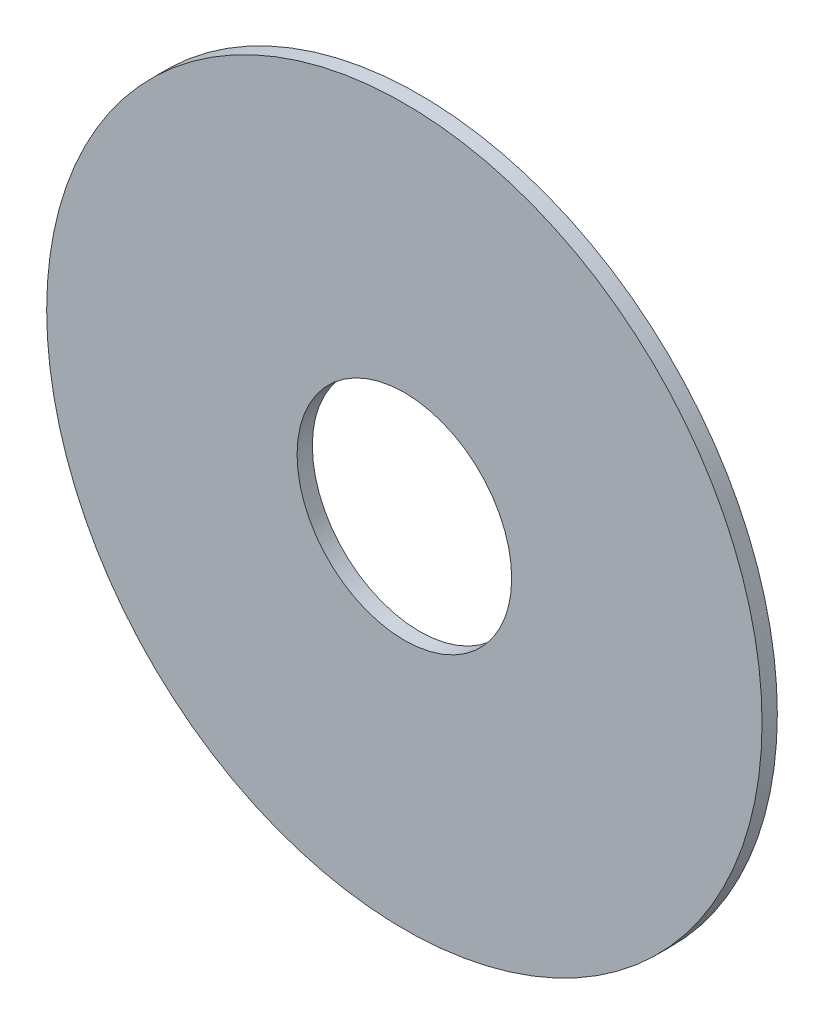
ISO-10303-21;
HEADER;
FILE_DESCRIPTION(('STEP AP214'),'2;1');
FILE_NAME('part.step','',(''),(''),'','','');
FILE_SCHEMA(('AUTOMOTIVE_DESIGN { 1 0 10303 214 1 1 1 1 }'));
ENDSEC;
DATA;
#1=APPLICATION_CONTEXT('core data for automotive mechanical design processes');
#2=APPLICATION_PROTOCOL_DEFINITION('international standard','automotive_design',2000,#1);
#3=PRODUCT_CONTEXT('',#1,'mechanical');
#4=PRODUCT('Part','Part','',(#3));
#5=PRODUCT_RELATED_PRODUCT_CATEGORY('part','',(#4));
#6=PRODUCT_DEFINITION_FORMATION('','',#4);
#7=PRODUCT_DEFINITION_CONTEXT('part definition',#1,'design');
#8=PRODUCT_DEFINITION('design','',#6,#7);
#9=PRODUCT_DEFINITION_SHAPE('','',#8);
#10=(LENGTH_UNIT() NAMED_UNIT(*) SI_UNIT(.MILLI.,.METRE.));
#11=(NAMED_UNIT(*) PLANE_ANGLE_UNIT() SI_UNIT($,.RADIAN.));
#12=(NAMED_UNIT(*) SI_UNIT($,.STERADIAN.) SOLID_ANGLE_UNIT());
#13=UNCERTAINTY_MEASURE_WITH_UNIT(LENGTH_MEASURE(1.E-05),#10,'distance_accuracy_value','');
#14=(GEOMETRIC_REPRESENTATION_CONTEXT(3) GLOBAL_UNCERTAINTY_ASSIGNED_CONTEXT((#13)) GLOBAL_UNIT_ASSIGNED_CONTEXT((#10,
#11,#12)) REPRESENTATION_CONTEXT('',''));
#15=CARTESIAN_POINT('',(0.,0.,0.));
#16=DIRECTION('',(0.,0.,1.));
#17=DIRECTION('',(1.,0.,0.));
#18=AXIS2_PLACEMENT_3D('',#15,#16,#17);
#19=CARTESIAN_POINT('',(0.,0.,0.8128));
#20=DIRECTION('',(0.,0.,1.));
#21=DIRECTION('',(1.,0.,0.));
#22=AXIS2_PLACEMENT_3D('',#19,#20,#21);
#23=PLANE('',#22);
#24=CARTESIAN_POINT('',(0.,0.,0.8128));
#25=DIRECTION('',(0.,0.,1.));
#26=DIRECTION('',(1.,0.,0.));
#27=AXIS2_PLACEMENT_3D('',#24,#25,#26);
#28=CIRCLE('',#27,19.05);
#29=CARTESIAN_POINT('',(19.05,0.,0.8128));
#30=VERTEX_POINT('',#29);
#31=EDGE_CURVE('E10',#30,#30,#28,.T.);
#32=ORIENTED_EDGE('',*,*,#31,.T.);
#33=EDGE_LOOP('',(#32));
#34=FACE_BOUND('',#33,.T.);
#35=CARTESIAN_POINT('',(0.,0.,0.8128));
#36=DIRECTION('',(0.,0.,1.));
#37=DIRECTION('',(1.,0.,0.));
#38=AXIS2_PLACEMENT_3D('',#35,#36,#37);
#39=CIRCLE('',#38,5.715);
#40=CARTESIAN_POINT('',(5.715,0.,0.8128));
#41=VERTEX_POINT('',#40);
#42=EDGE_CURVE('E41',#41,#41,#39,.T.);
#43=ORIENTED_EDGE('',*,*,#42,.F.);
#44=EDGE_LOOP('',(#43));
#45=FACE_BOUND('',#44,.T.);
#46=ADVANCED_FACE('F30',(#34,#45),#23,.T.);
#47=CARTESIAN_POINT('',(0.,0.,0.));
#48=DIRECTION('',(0.,0.,1.));
#49=DIRECTION('',(1.,0.,0.));
#50=AXIS2_PLACEMENT_3D('',#47,#48,#49);
#51=PLANE('',#50);
#52=CARTESIAN_POINT('',(0.,0.,0.));
#53=DIRECTION('',(0.,0.,1.));
#54=DIRECTION('',(1.,0.,0.));
#55=AXIS2_PLACEMENT_3D('',#52,#53,#54);
#56=CIRCLE('',#55,19.05);
#57=CARTESIAN_POINT('',(19.05,0.,0.));
#58=VERTEX_POINT('',#57);
#59=EDGE_CURVE('E34',#58,#58,#56,.T.);
#60=ORIENTED_EDGE('',*,*,#59,.F.);
#61=EDGE_LOOP('',(#60));
#62=FACE_BOUND('',#61,.T.);
#63=CARTESIAN_POINT('',(0.,0.,0.));
#64=DIRECTION('',(0.,0.,1.));
#65=DIRECTION('',(1.,0.,0.));
#66=AXIS2_PLACEMENT_3D('',#63,#64,#65);
#67=CIRCLE('',#66,5.715);
#68=CARTESIAN_POINT('',(5.715,0.,0.));
#69=VERTEX_POINT('',#68);
#70=EDGE_CURVE('E43',#69,#69,#67,.T.);
#71=ORIENTED_EDGE('',*,*,#70,.T.);
#72=EDGE_LOOP('',(#71));
#73=FACE_BOUND('',#72,.T.);
#74=ADVANCED_FACE('F53',(#62,#73),#51,.F.);
#75=CARTESIAN_POINT('',(0.,0.,0.8128));
#76=DIRECTION('',(0.,0.,-1.));
#77=DIRECTION('',(-1.,0.,0.));
#78=AXIS2_PLACEMENT_3D('',#75,#76,#77);
#79=CYLINDRICAL_SURFACE('',#78,19.05);
#80=ORIENTED_EDGE('',*,*,#31,.F.);
#81=EDGE_LOOP('',(#80));
#82=FACE_BOUND('',#81,.T.);
#83=ORIENTED_EDGE('',*,*,#59,.T.);
#84=EDGE_LOOP('',(#83));
#85=FACE_BOUND('',#84,.T.);
#86=ADVANCED_FACE('F32',(#82,#85),#79,.T.);
#87=CARTESIAN_POINT('',(0.,0.,0.8128));
#88=DIRECTION('',(0.,0.,-1.));
#89=DIRECTION('',(-1.,0.,0.));
#90=AXIS2_PLACEMENT_3D('',#87,#88,#89);
#91=CYLINDRICAL_SURFACE('',#90,5.715);
#92=ORIENTED_EDGE('',*,*,#42,.T.);
#93=EDGE_LOOP('',(#92));
#94=FACE_BOUND('',#93,.T.);
#95=ORIENTED_EDGE('',*,*,#70,.F.);
#96=EDGE_LOOP('',(#95));
#97=FACE_BOUND('',#96,.T.);
#98=ADVANCED_FACE('F49',(#94,#97),#91,.F.);
#99=CLOSED_SHELL('',(#46,#74,#86,#98));
#100=MANIFOLD_SOLID_BREP('B2',#99);
#101=ADVANCED_BREP_SHAPE_REPRESENTATION('',(#18,#100),#14);
#102=SHAPE_DEFINITION_REPRESENTATION(#9,#101);
ENDSEC;
END-ISO-10303-21;
